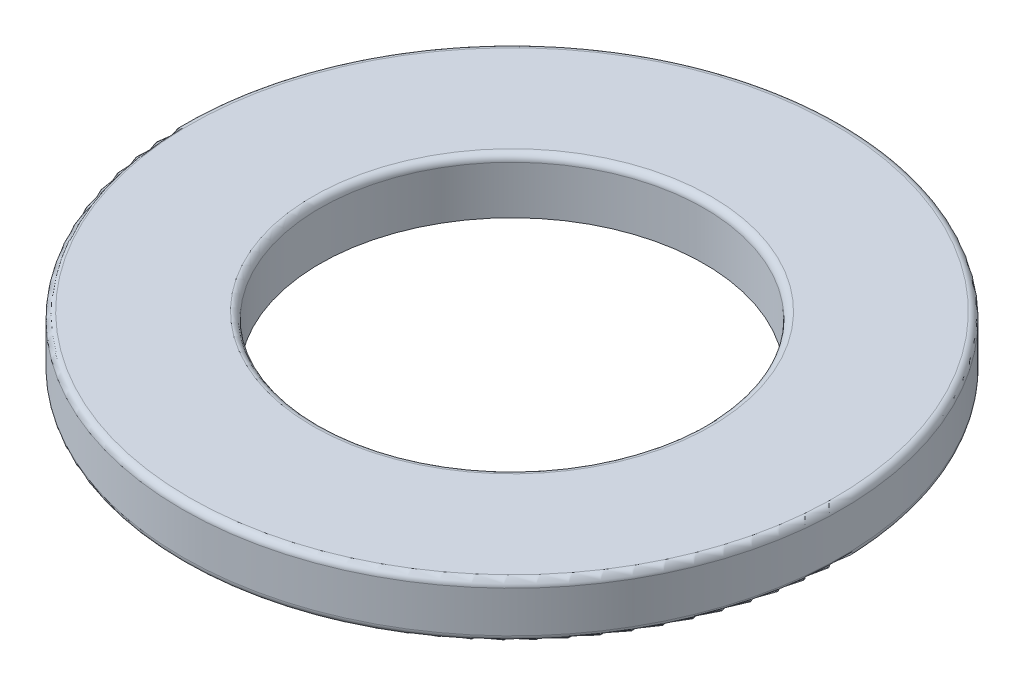
ISO-10303-21;
HEADER;
FILE_DESCRIPTION(('STEP AP214'),'2;1');
FILE_NAME('part.step','',(''),(''),'','','');
FILE_SCHEMA(('AUTOMOTIVE_DESIGN { 1 0 10303 214 1 1 1 1 }'));
ENDSEC;
DATA;
#1=APPLICATION_CONTEXT('core data for automotive mechanical design processes');
#2=APPLICATION_PROTOCOL_DEFINITION('international standard','automotive_design',2000,#1);
#3=PRODUCT_CONTEXT('',#1,'mechanical');
#4=PRODUCT('Part','Part','',(#3));
#5=PRODUCT_RELATED_PRODUCT_CATEGORY('part','',(#4));
#6=PRODUCT_DEFINITION_FORMATION('','',#4);
#7=PRODUCT_DEFINITION_CONTEXT('part definition',#1,'design');
#8=PRODUCT_DEFINITION('design','',#6,#7);
#9=PRODUCT_DEFINITION_SHAPE('','',#8);
#10=(LENGTH_UNIT() NAMED_UNIT(*) SI_UNIT(.MILLI.,.METRE.));
#11=(NAMED_UNIT(*) PLANE_ANGLE_UNIT() SI_UNIT($,.RADIAN.));
#12=(NAMED_UNIT(*) SI_UNIT($,.STERADIAN.) SOLID_ANGLE_UNIT());
#13=UNCERTAINTY_MEASURE_WITH_UNIT(LENGTH_MEASURE(1.E-05),#10,'distance_accuracy_value','');
#14=(GEOMETRIC_REPRESENTATION_CONTEXT(3) GLOBAL_UNCERTAINTY_ASSIGNED_CONTEXT((#13)) GLOBAL_UNIT_ASSIGNED_CONTEXT((#10,
#11,#12)) REPRESENTATION_CONTEXT('',''));
#15=CARTESIAN_POINT('',(0.,0.,0.));
#16=DIRECTION('',(0.,0.,1.));
#17=DIRECTION('',(1.,0.,0.));
#18=AXIS2_PLACEMENT_3D('',#15,#16,#17);
#19=CARTESIAN_POINT('',(0.,2.,0.));
#20=DIRECTION('',(0.,-1.,0.));
#21=DIRECTION('',(0.,0.,-1.));
#22=AXIS2_PLACEMENT_3D('',#19,#20,#21);
#23=CYLINDRICAL_SURFACE('',#22,12.);
#24=CARTESIAN_POINT('',(0.,0.25,0.));
#25=DIRECTION('',(0.,1.,0.));
#26=DIRECTION('',(0.,0.,1.));
#27=AXIS2_PLACEMENT_3D('',#24,#25,#26);
#28=CIRCLE('',#27,12.);
#29=CARTESIAN_POINT('',(0.,0.25,12.));
#30=VERTEX_POINT('',#29);
#31=EDGE_CURVE('E61',#30,#30,#28,.T.);
#32=ORIENTED_EDGE('',*,*,#31,.T.);
#33=EDGE_LOOP('',(#32));
#34=FACE_BOUND('',#33,.T.);
#35=CARTESIAN_POINT('',(0.,1.75,0.));
#36=DIRECTION('',(0.,1.,0.));
#37=DIRECTION('',(0.,0.,1.));
#38=AXIS2_PLACEMENT_3D('',#35,#36,#37);
#39=CIRCLE('',#38,12.);
#40=CARTESIAN_POINT('',(0.,1.75,12.));
#41=VERTEX_POINT('',#40);
#42=EDGE_CURVE('E65',#41,#41,#39,.F.);
#43=ORIENTED_EDGE('',*,*,#42,.T.);
#44=EDGE_LOOP('',(#43));
#45=FACE_BOUND('',#44,.T.);
#46=ADVANCED_FACE('F37',(#34,#45),#23,.T.);
#47=CARTESIAN_POINT('',(0.,2.,0.));
#48=DIRECTION('',(0.,1.,0.));
#49=DIRECTION('',(0.,0.,1.));
#50=AXIS2_PLACEMENT_3D('',#47,#48,#49);
#51=PLANE('',#50);
#52=CARTESIAN_POINT('',(0.,2.,0.));
#53=DIRECTION('',(0.,1.,0.));
#54=DIRECTION('',(0.,0.,1.));
#55=AXIS2_PLACEMENT_3D('',#52,#53,#54);
#56=CIRCLE('',#55,7.25);
#57=CARTESIAN_POINT('',(0.,2.,7.25));
#58=VERTEX_POINT('',#57);
#59=EDGE_CURVE('E10',#58,#58,#56,.F.);
#60=ORIENTED_EDGE('',*,*,#59,.T.);
#61=EDGE_LOOP('',(#60));
#62=FACE_BOUND('',#61,.T.);
#63=CARTESIAN_POINT('',(0.,2.,0.));
#64=DIRECTION('',(0.,1.,0.));
#65=DIRECTION('',(0.,0.,1.));
#66=AXIS2_PLACEMENT_3D('',#63,#64,#65);
#67=CIRCLE('',#66,11.75);
#68=CARTESIAN_POINT('',(0.,2.,11.75));
#69=VERTEX_POINT('',#68);
#70=EDGE_CURVE('E45',#69,#69,#67,.T.);
#71=ORIENTED_EDGE('',*,*,#70,.T.);
#72=EDGE_LOOP('',(#71));
#73=FACE_BOUND('',#72,.T.);
#74=ADVANCED_FACE('F88',(#62,#73),#51,.T.);
#75=CARTESIAN_POINT('',(0.,0.,0.));
#76=DIRECTION('',(0.,1.,0.));
#77=DIRECTION('',(0.,0.,1.));
#78=AXIS2_PLACEMENT_3D('',#75,#76,#77);
#79=PLANE('',#78);
#80=CARTESIAN_POINT('',(0.,0.,0.));
#81=DIRECTION('',(0.,1.,0.));
#82=DIRECTION('',(0.,0.,1.));
#83=AXIS2_PLACEMENT_3D('',#80,#81,#82);
#84=CIRCLE('',#83,11.75);
#85=CARTESIAN_POINT('',(0.,0.,11.75));
#86=VERTEX_POINT('',#85);
#87=EDGE_CURVE('E55',#86,#86,#84,.F.);
#88=ORIENTED_EDGE('',*,*,#87,.T.);
#89=EDGE_LOOP('',(#88));
#90=FACE_BOUND('',#89,.T.);
#91=CARTESIAN_POINT('',(0.,0.,0.));
#92=DIRECTION('',(0.,1.,0.));
#93=DIRECTION('',(0.,0.,1.));
#94=AXIS2_PLACEMENT_3D('',#91,#92,#93);
#95=CIRCLE('',#94,7.);
#96=CARTESIAN_POINT('',(0.,0.,7.));
#97=VERTEX_POINT('',#96);
#98=EDGE_CURVE('E69',#97,#97,#95,.T.);
#99=ORIENTED_EDGE('',*,*,#98,.T.);
#100=EDGE_LOOP('',(#99));
#101=FACE_BOUND('',#100,.T.);
#102=ADVANCED_FACE('F74',(#90,#101),#79,.F.);
#103=CARTESIAN_POINT('',(0.,0.,0.));
#104=DIRECTION('',(0.,1.,0.));
#105=DIRECTION('',(0.,0.,1.));
#106=AXIS2_PLACEMENT_3D('',#103,#104,#105);
#107=CYLINDRICAL_SURFACE('',#106,7.);
#108=CARTESIAN_POINT('',(0.,1.75,0.));
#109=DIRECTION('',(0.,1.,0.));
#110=DIRECTION('',(0.,0.,1.));
#111=AXIS2_PLACEMENT_3D('',#108,#109,#110);
#112=CIRCLE('',#111,7.);
#113=CARTESIAN_POINT('',(0.,1.75,7.));
#114=VERTEX_POINT('',#113);
#115=EDGE_CURVE('E50',#114,#114,#112,.T.);
#116=ORIENTED_EDGE('',*,*,#115,.T.);
#117=EDGE_LOOP('',(#116));
#118=FACE_BOUND('',#117,.T.);
#119=ORIENTED_EDGE('',*,*,#98,.F.);
#120=EDGE_LOOP('',(#119));
#121=FACE_BOUND('',#120,.T.);
#122=ADVANCED_FACE('F76',(#118,#121),#107,.F.);
#123=CARTESIAN_POINT('',(0.,0.25,0.));
#124=DIRECTION('',(0.,1.,0.));
#125=DIRECTION('',(0.,0.,1.));
#126=AXIS2_PLACEMENT_3D('',#123,#124,#125);
#127=TOROIDAL_SURFACE('',#126,11.75,0.25);
#128=ORIENTED_EDGE('',*,*,#87,.F.);
#129=EDGE_LOOP('',(#128));
#130=FACE_BOUND('',#129,.T.);
#131=ORIENTED_EDGE('',*,*,#31,.F.);
#132=EDGE_LOOP('',(#131));
#133=FACE_BOUND('',#132,.T.);
#134=ADVANCED_FACE('F78',(#130,#133),#127,.T.);
#135=CARTESIAN_POINT('',(0.,1.75,0.));
#136=DIRECTION('',(0.,1.,0.));
#137=DIRECTION('',(0.,0.,1.));
#138=AXIS2_PLACEMENT_3D('',#135,#136,#137);
#139=TOROIDAL_SURFACE('',#138,7.25,0.25);
#140=ORIENTED_EDGE('',*,*,#59,.F.);
#141=EDGE_LOOP('',(#140));
#142=FACE_BOUND('',#141,.T.);
#143=ORIENTED_EDGE('',*,*,#115,.F.);
#144=EDGE_LOOP('',(#143));
#145=FACE_BOUND('',#144,.T.);
#146=ADVANCED_FACE('F85',(#142,#145),#139,.T.);
#147=CARTESIAN_POINT('',(0.,1.75,0.));
#148=DIRECTION('',(0.,1.,0.));
#149=DIRECTION('',(0.,0.,1.));
#150=AXIS2_PLACEMENT_3D('',#147,#148,#149);
#151=TOROIDAL_SURFACE('',#150,11.75,0.25);
#152=ORIENTED_EDGE('',*,*,#42,.F.);
#153=EDGE_LOOP('',(#152));
#154=FACE_BOUND('',#153,.T.);
#155=ORIENTED_EDGE('',*,*,#70,.F.);
#156=EDGE_LOOP('',(#155));
#157=FACE_BOUND('',#156,.T.);
#158=ADVANCED_FACE('F39',(#154,#157),#151,.T.);
#159=CLOSED_SHELL('',(#46,#74,#102,#122,#134,#146,#158));
#160=MANIFOLD_SOLID_BREP('B2',#159);
#161=ADVANCED_BREP_SHAPE_REPRESENTATION('',(#18,#160),#14);
#162=SHAPE_DEFINITION_REPRESENTATION(#9,#161);
ENDSEC;
END-ISO-10303-21;
